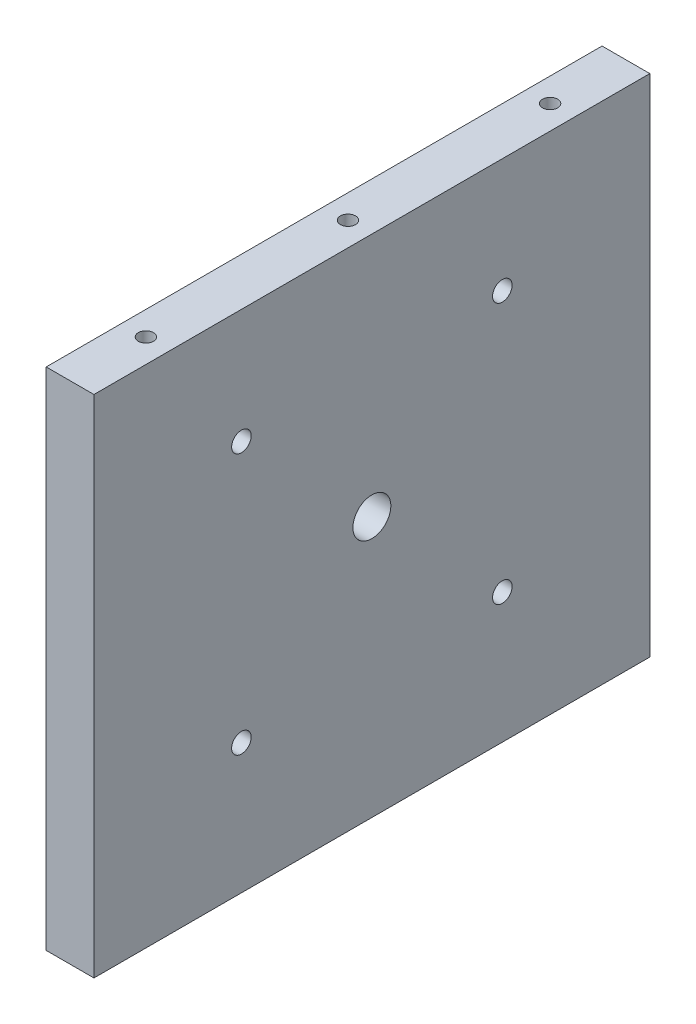
ISO-10303-21;
HEADER;
FILE_DESCRIPTION(('STEP AP214'),'2;1');
FILE_NAME('part.step','',(''),(''),'','','');
FILE_SCHEMA(('AUTOMOTIVE_DESIGN { 1 0 10303 214 1 1 1 1 }'));
ENDSEC;
DATA;
#1=APPLICATION_CONTEXT('core data for automotive mechanical design processes');
#2=APPLICATION_PROTOCOL_DEFINITION('international standard','automotive_design',2000,#1);
#3=PRODUCT_CONTEXT('',#1,'mechanical');
#4=PRODUCT('Part','Part','',(#3));
#5=PRODUCT_RELATED_PRODUCT_CATEGORY('part','',(#4));
#6=PRODUCT_DEFINITION_FORMATION('','',#4);
#7=PRODUCT_DEFINITION_CONTEXT('part definition',#1,'design');
#8=PRODUCT_DEFINITION('design','',#6,#7);
#9=PRODUCT_DEFINITION_SHAPE('','',#8);
#10=(LENGTH_UNIT() NAMED_UNIT(*) SI_UNIT(.MILLI.,.METRE.));
#11=(NAMED_UNIT(*) PLANE_ANGLE_UNIT() SI_UNIT($,.RADIAN.));
#12=(NAMED_UNIT(*) SI_UNIT($,.STERADIAN.) SOLID_ANGLE_UNIT());
#13=UNCERTAINTY_MEASURE_WITH_UNIT(LENGTH_MEASURE(1.E-05),#10,'distance_accuracy_value','');
#14=(GEOMETRIC_REPRESENTATION_CONTEXT(3) GLOBAL_UNCERTAINTY_ASSIGNED_CONTEXT((#13)) GLOBAL_UNIT_ASSIGNED_CONTEXT((#10,
#11,#12)) REPRESENTATION_CONTEXT('',''));
#15=CARTESIAN_POINT('',(0.,0.,0.));
#16=DIRECTION('',(0.,0.,1.));
#17=DIRECTION('',(1.,0.,0.));
#18=AXIS2_PLACEMENT_3D('',#15,#16,#17);
#19=CARTESIAN_POINT('',(12.,1.97,0.));
#20=DIRECTION('',(-1.,0.,0.));
#21=DIRECTION('',(0.,0.,1.));
#22=AXIS2_PLACEMENT_3D('',#19,#20,#21);
#23=CYLINDRICAL_SURFACE('',#22,4.7625);
#24=CARTESIAN_POINT('',(12.,1.97,0.));
#25=DIRECTION('',(-1.,0.,0.));
#26=DIRECTION('',(0.,0.,1.));
#27=AXIS2_PLACEMENT_3D('',#24,#25,#26);
#28=CIRCLE('',#27,4.7625);
#29=CARTESIAN_POINT('',(12.,1.97,4.7625));
#30=VERTEX_POINT('',#29);
#31=EDGE_CURVE('E170',#30,#30,#28,.T.);
#32=ORIENTED_EDGE('',*,*,#31,.F.);
#33=EDGE_LOOP('',(#32));
#34=FACE_BOUND('',#33,.T.);
#35=CARTESIAN_POINT('',(2.159,1.97,0.));
#36=DIRECTION('',(-1.,0.,0.));
#37=DIRECTION('',(0.,0.,1.));
#38=AXIS2_PLACEMENT_3D('',#35,#36,#37);
#39=CIRCLE('',#38,4.7625);
#40=CARTESIAN_POINT('',(2.159,1.97,4.7625));
#41=VERTEX_POINT('',#40);
#42=EDGE_CURVE('E47',#41,#41,#39,.F.);
#43=ORIENTED_EDGE('',*,*,#42,.F.);
#44=EDGE_LOOP('',(#43));
#45=FACE_BOUND('',#44,.T.);
#46=ADVANCED_FACE('F43',(#34,#45),#23,.F.);
#47=CARTESIAN_POINT('',(12.,-63.5,-69.85));
#48=DIRECTION('',(0.,0.,1.));
#49=DIRECTION('',(1.,0.,0.));
#50=AXIS2_PLACEMENT_3D('',#47,#48,#49);
#51=PLANE('',#50);
#52=DIRECTION('',(0.,1.,0.));
#53=VECTOR('',#52,1.);
#54=CARTESIAN_POINT('',(0.,-63.5,-69.85));
#55=LINE('',#54,#53);
#56=CARTESIAN_POINT('',(0.,-63.5,-69.85));
#57=VERTEX_POINT('',#56);
#58=CARTESIAN_POINT('',(0.,63.5,-69.85));
#59=VERTEX_POINT('',#58);
#60=EDGE_CURVE('E214',#57,#59,#55,.T.);
#61=ORIENTED_EDGE('',*,*,#60,.T.);
#62=DIRECTION('',(-1.,0.,0.));
#63=VECTOR('',#62,1.);
#64=CARTESIAN_POINT('',(12.,63.5,-69.85));
#65=LINE('',#64,#63);
#66=CARTESIAN_POINT('',(12.,63.5,-69.85));
#67=VERTEX_POINT('',#66);
#68=EDGE_CURVE('E11',#67,#59,#65,.T.);
#69=ORIENTED_EDGE('',*,*,#68,.F.);
#70=DIRECTION('',(0.,1.,0.));
#71=VECTOR('',#70,1.);
#72=CARTESIAN_POINT('',(12.,-63.5,-69.85));
#73=LINE('',#72,#71);
#74=CARTESIAN_POINT('',(12.,-63.5,-69.85));
#75=VERTEX_POINT('',#74);
#76=EDGE_CURVE('E215',#75,#67,#73,.T.);
#77=ORIENTED_EDGE('',*,*,#76,.F.);
#78=DIRECTION('',(-1.,0.,0.));
#79=VECTOR('',#78,1.);
#80=CARTESIAN_POINT('',(12.,-63.5,-69.85));
#81=LINE('',#80,#79);
#82=EDGE_CURVE('E225',#75,#57,#81,.T.);
#83=ORIENTED_EDGE('',*,*,#82,.T.);
#84=EDGE_LOOP('',(#61,#69,#77,#83));
#85=FACE_BOUND('',#84,.T.);
#86=ADVANCED_FACE('F45',(#85),#51,.F.);
#87=CARTESIAN_POINT('',(12.,63.5,69.85));
#88=DIRECTION('',(0.,-1.,0.));
#89=DIRECTION('',(0.,0.,-1.));
#90=AXIS2_PLACEMENT_3D('',#87,#88,#89);
#91=PLANE('',#90);
#92=CARTESIAN_POINT('',(6.00000000000002,63.5,-50.8));
#93=DIRECTION('',(0.,1.,0.));
#94=DIRECTION('',(0.,0.,1.));
#95=AXIS2_PLACEMENT_3D('',#92,#93,#94);
#96=CIRCLE('',#95,1.89864999999999);
#97=CARTESIAN_POINT('',(6.00000000000002,63.5,-48.90135));
#98=VERTEX_POINT('',#97);
#99=EDGE_CURVE('E124',#98,#98,#96,.T.);
#100=ORIENTED_EDGE('',*,*,#99,.F.);
#101=EDGE_LOOP('',(#100));
#102=FACE_BOUND('',#101,.T.);
#103=CARTESIAN_POINT('',(6.,63.5,0.));
#104=DIRECTION('',(0.,1.,0.));
#105=DIRECTION('',(0.,0.,1.));
#106=AXIS2_PLACEMENT_3D('',#103,#104,#105);
#107=CIRCLE('',#106,1.89864999999999);
#108=CARTESIAN_POINT('',(6.,63.5,1.89864999999999));
#109=VERTEX_POINT('',#108);
#110=EDGE_CURVE('E123',#109,#109,#107,.T.);
#111=ORIENTED_EDGE('',*,*,#110,.F.);
#112=EDGE_LOOP('',(#111));
#113=FACE_BOUND('',#112,.T.);
#114=CARTESIAN_POINT('',(6.,63.5,50.8));
#115=DIRECTION('',(0.,1.,0.));
#116=DIRECTION('',(0.,0.,1.));
#117=AXIS2_PLACEMENT_3D('',#114,#115,#116);
#118=CIRCLE('',#117,1.89864999999999);
#119=CARTESIAN_POINT('',(6.,63.5,52.69865));
#120=VERTEX_POINT('',#119);
#121=EDGE_CURVE('E138',#120,#120,#118,.T.);
#122=ORIENTED_EDGE('',*,*,#121,.F.);
#123=EDGE_LOOP('',(#122));
#124=FACE_BOUND('',#123,.T.);
#125=DIRECTION('',(0.,0.,1.));
#126=VECTOR('',#125,1.);
#127=CARTESIAN_POINT('',(0.,63.5,69.85));
#128=LINE('',#127,#126);
#129=CARTESIAN_POINT('',(0.,63.5,69.85));
#130=VERTEX_POINT('',#129);
#131=EDGE_CURVE('E229',#59,#130,#128,.T.);
#132=ORIENTED_EDGE('',*,*,#131,.T.);
#133=DIRECTION('',(-1.,0.,0.));
#134=VECTOR('',#133,1.);
#135=CARTESIAN_POINT('',(12.,63.5,69.85));
#136=LINE('',#135,#134);
#137=CARTESIAN_POINT('',(12.,63.5,69.85));
#138=VERTEX_POINT('',#137);
#139=EDGE_CURVE('E54',#138,#130,#136,.T.);
#140=ORIENTED_EDGE('',*,*,#139,.F.);
#141=DIRECTION('',(0.,0.,1.));
#142=VECTOR('',#141,1.);
#143=CARTESIAN_POINT('',(12.,63.5,69.85));
#144=LINE('',#143,#142);
#145=EDGE_CURVE('E93',#67,#138,#144,.T.);
#146=ORIENTED_EDGE('',*,*,#145,.F.);
#147=ORIENTED_EDGE('',*,*,#68,.T.);
#148=EDGE_LOOP('',(#132,#140,#146,#147));
#149=FACE_BOUND('',#148,.T.);
#150=ADVANCED_FACE('F261',(#102,#113,#124,#149),#91,.F.);
#151=CARTESIAN_POINT('',(12.,-63.5,69.85));
#152=DIRECTION('',(0.,0.,-1.));
#153=DIRECTION('',(-1.,0.,0.));
#154=AXIS2_PLACEMENT_3D('',#151,#152,#153);
#155=PLANE('',#154);
#156=DIRECTION('',(0.,-1.,0.));
#157=VECTOR('',#156,1.);
#158=CARTESIAN_POINT('',(0.,-63.5,69.85));
#159=LINE('',#158,#157);
#160=CARTESIAN_POINT('',(0.,-63.5,69.85));
#161=VERTEX_POINT('',#160);
#162=EDGE_CURVE('E80',#130,#161,#159,.T.);
#163=ORIENTED_EDGE('',*,*,#162,.T.);
#164=DIRECTION('',(-1.,0.,0.));
#165=VECTOR('',#164,1.);
#166=CARTESIAN_POINT('',(12.,-63.5,69.85));
#167=LINE('',#166,#165);
#168=CARTESIAN_POINT('',(12.,-63.5,69.85));
#169=VERTEX_POINT('',#168);
#170=EDGE_CURVE('E238',#169,#161,#167,.T.);
#171=ORIENTED_EDGE('',*,*,#170,.F.);
#172=DIRECTION('',(0.,-1.,0.));
#173=VECTOR('',#172,1.);
#174=CARTESIAN_POINT('',(12.,-63.5,69.85));
#175=LINE('',#174,#173);
#176=EDGE_CURVE('E220',#138,#169,#175,.T.);
#177=ORIENTED_EDGE('',*,*,#176,.F.);
#178=ORIENTED_EDGE('',*,*,#139,.T.);
#179=EDGE_LOOP('',(#163,#171,#177,#178));
#180=FACE_BOUND('',#179,.T.);
#181=ADVANCED_FACE('F243',(#180),#155,.F.);
#182=CARTESIAN_POINT('',(12.,-63.5,69.85));
#183=DIRECTION('',(0.,1.,0.));
#184=DIRECTION('',(0.,0.,1.));
#185=AXIS2_PLACEMENT_3D('',#182,#183,#184);
#186=PLANE('',#185);
#187=CARTESIAN_POINT('',(6.00000000000002,-63.5,-50.8));
#188=DIRECTION('',(0.,-1.,0.));
#189=DIRECTION('',(0.,0.,-1.));
#190=AXIS2_PLACEMENT_3D('',#187,#188,#189);
#191=CIRCLE('',#190,1.89864999999999);
#192=CARTESIAN_POINT('',(6.00000000000002,-63.5,-52.69865));
#193=VERTEX_POINT('',#192);
#194=EDGE_CURVE('E146',#193,#193,#191,.T.);
#195=ORIENTED_EDGE('',*,*,#194,.F.);
#196=EDGE_LOOP('',(#195));
#197=FACE_BOUND('',#196,.T.);
#198=CARTESIAN_POINT('',(6.,-63.5,0.));
#199=DIRECTION('',(0.,-1.,0.));
#200=DIRECTION('',(0.,0.,-1.));
#201=AXIS2_PLACEMENT_3D('',#198,#199,#200);
#202=CIRCLE('',#201,1.89864999999999);
#203=CARTESIAN_POINT('',(6.,-63.5,-1.89864999999999));
#204=VERTEX_POINT('',#203);
#205=EDGE_CURVE('E154',#204,#204,#202,.T.);
#206=ORIENTED_EDGE('',*,*,#205,.F.);
#207=EDGE_LOOP('',(#206));
#208=FACE_BOUND('',#207,.T.);
#209=CARTESIAN_POINT('',(6.,-63.5,50.8));
#210=DIRECTION('',(0.,-1.,0.));
#211=DIRECTION('',(0.,0.,-1.));
#212=AXIS2_PLACEMENT_3D('',#209,#210,#211);
#213=CIRCLE('',#212,1.89864999999999);
#214=CARTESIAN_POINT('',(6.,-63.5,48.90135));
#215=VERTEX_POINT('',#214);
#216=EDGE_CURVE('E162',#215,#215,#213,.T.);
#217=ORIENTED_EDGE('',*,*,#216,.F.);
#218=EDGE_LOOP('',(#217));
#219=FACE_BOUND('',#218,.T.);
#220=DIRECTION('',(0.,0.,-1.));
#221=VECTOR('',#220,1.);
#222=CARTESIAN_POINT('',(0.,-63.5,69.85));
#223=LINE('',#222,#221);
#224=EDGE_CURVE('E86',#161,#57,#223,.T.);
#225=ORIENTED_EDGE('',*,*,#224,.T.);
#226=ORIENTED_EDGE('',*,*,#82,.F.);
#227=DIRECTION('',(0.,0.,-1.));
#228=VECTOR('',#227,1.);
#229=CARTESIAN_POINT('',(12.,-63.5,69.85));
#230=LINE('',#229,#228);
#231=EDGE_CURVE('E62',#169,#75,#230,.T.);
#232=ORIENTED_EDGE('',*,*,#231,.F.);
#233=ORIENTED_EDGE('',*,*,#170,.T.);
#234=EDGE_LOOP('',(#225,#226,#232,#233));
#235=FACE_BOUND('',#234,.T.);
#236=ADVANCED_FACE('F250',(#197,#208,#219,#235),#186,.F.);
#237=CARTESIAN_POINT('',(12.,0.,0.));
#238=DIRECTION('',(-1.,0.,0.));
#239=DIRECTION('',(0.,0.,1.));
#240=AXIS2_PLACEMENT_3D('',#237,#238,#239);
#241=PLANE('',#240);
#242=ORIENTED_EDGE('',*,*,#31,.T.);
#243=EDGE_LOOP('',(#242));
#244=FACE_BOUND('',#243,.T.);
#245=CARTESIAN_POINT('',(12.,34.7569150980235,-32.7869150980234));
#246=DIRECTION('',(-1.,0.,0.));
#247=DIRECTION('',(0.,0.,1.));
#248=AXIS2_PLACEMENT_3D('',#245,#246,#247);
#249=CIRCLE('',#248,2.45745);
#250=CARTESIAN_POINT('',(12.,34.7569150980235,-30.3294650980234));
#251=VERTEX_POINT('',#250);
#252=EDGE_CURVE('E186',#251,#251,#249,.T.);
#253=ORIENTED_EDGE('',*,*,#252,.T.);
#254=EDGE_LOOP('',(#253));
#255=FACE_BOUND('',#254,.T.);
#256=CARTESIAN_POINT('',(12.,34.7569150980235,32.7869150980234));
#257=DIRECTION('',(-1.,0.,0.));
#258=DIRECTION('',(0.,0.,1.));
#259=AXIS2_PLACEMENT_3D('',#256,#257,#258);
#260=CIRCLE('',#259,2.45745);
#261=CARTESIAN_POINT('',(12.,34.7569150980235,35.2443650980234));
#262=VERTEX_POINT('',#261);
#263=EDGE_CURVE('E194',#262,#262,#260,.T.);
#264=ORIENTED_EDGE('',*,*,#263,.T.);
#265=EDGE_LOOP('',(#264));
#266=FACE_BOUND('',#265,.T.);
#267=CARTESIAN_POINT('',(12.,-30.8169150980235,32.7869150980234));
#268=DIRECTION('',(-1.,0.,0.));
#269=DIRECTION('',(0.,0.,1.));
#270=AXIS2_PLACEMENT_3D('',#267,#268,#269);
#271=CIRCLE('',#270,2.45745);
#272=CARTESIAN_POINT('',(12.,-30.8169150980235,35.2443650980234));
#273=VERTEX_POINT('',#272);
#274=EDGE_CURVE('E202',#273,#273,#271,.T.);
#275=ORIENTED_EDGE('',*,*,#274,.T.);
#276=EDGE_LOOP('',(#275));
#277=FACE_BOUND('',#276,.T.);
#278=CARTESIAN_POINT('',(12.,-30.8169150980235,-32.7869150980234));
#279=DIRECTION('',(-1.,0.,0.));
#280=DIRECTION('',(0.,0.,1.));
#281=AXIS2_PLACEMENT_3D('',#278,#279,#280);
#282=CIRCLE('',#281,2.45745);
#283=CARTESIAN_POINT('',(12.,-30.8169150980235,-30.3294650980234));
#284=VERTEX_POINT('',#283);
#285=EDGE_CURVE('E210',#284,#284,#282,.T.);
#286=ORIENTED_EDGE('',*,*,#285,.T.);
#287=EDGE_LOOP('',(#286));
#288=FACE_BOUND('',#287,.T.);
#289=ORIENTED_EDGE('',*,*,#76,.T.);
#290=ORIENTED_EDGE('',*,*,#145,.T.);
#291=ORIENTED_EDGE('',*,*,#176,.T.);
#292=ORIENTED_EDGE('',*,*,#231,.T.);
#293=EDGE_LOOP('',(#289,#290,#291,#292));
#294=FACE_BOUND('',#293,.T.);
#295=ADVANCED_FACE('F252',(#244,#255,#266,#277,#288,#294),#241,.F.);
#296=CARTESIAN_POINT('',(0.,0.,0.));
#297=DIRECTION('',(-1.,0.,0.));
#298=DIRECTION('',(0.,0.,1.));
#299=AXIS2_PLACEMENT_3D('',#296,#297,#298);
#300=PLANE('',#299);
#301=CARTESIAN_POINT('',(0.,1.97,0.));
#302=DIRECTION('',(-1.,0.,0.));
#303=DIRECTION('',(0.,0.,1.));
#304=AXIS2_PLACEMENT_3D('',#301,#302,#303);
#305=CIRCLE('',#304,43.18);
#306=CARTESIAN_POINT('',(0.,1.97,43.18));
#307=VERTEX_POINT('',#306);
#308=EDGE_CURVE('E174',#307,#307,#305,.T.);
#309=ORIENTED_EDGE('',*,*,#308,.F.);
#310=EDGE_LOOP('',(#309));
#311=FACE_BOUND('',#310,.T.);
#312=CARTESIAN_POINT('',(0.,34.7569150980235,-32.7869150980234));
#313=DIRECTION('',(-1.,0.,0.));
#314=DIRECTION('',(0.,0.,1.));
#315=AXIS2_PLACEMENT_3D('',#312,#313,#314);
#316=CIRCLE('',#315,2.45745);
#317=CARTESIAN_POINT('',(0.,34.7569150980235,-30.3294650980234));
#318=VERTEX_POINT('',#317);
#319=EDGE_CURVE('E179',#318,#318,#316,.T.);
#320=ORIENTED_EDGE('',*,*,#319,.F.);
#321=EDGE_LOOP('',(#320));
#322=FACE_BOUND('',#321,.T.);
#323=CARTESIAN_POINT('',(0.,34.7569150980235,32.7869150980234));
#324=DIRECTION('',(-1.,0.,0.));
#325=DIRECTION('',(0.,0.,1.));
#326=AXIS2_PLACEMENT_3D('',#323,#324,#325);
#327=CIRCLE('',#326,2.45745);
#328=CARTESIAN_POINT('',(0.,34.7569150980235,35.2443650980234));
#329=VERTEX_POINT('',#328);
#330=EDGE_CURVE('E190',#329,#329,#327,.T.);
#331=ORIENTED_EDGE('',*,*,#330,.F.);
#332=EDGE_LOOP('',(#331));
#333=FACE_BOUND('',#332,.T.);
#334=CARTESIAN_POINT('',(0.,-30.8169150980235,32.7869150980234));
#335=DIRECTION('',(-1.,0.,0.));
#336=DIRECTION('',(0.,0.,1.));
#337=AXIS2_PLACEMENT_3D('',#334,#335,#336);
#338=CIRCLE('',#337,2.45745);
#339=CARTESIAN_POINT('',(0.,-30.8169150980235,35.2443650980234));
#340=VERTEX_POINT('',#339);
#341=EDGE_CURVE('E198',#340,#340,#338,.T.);
#342=ORIENTED_EDGE('',*,*,#341,.F.);
#343=EDGE_LOOP('',(#342));
#344=FACE_BOUND('',#343,.T.);
#345=CARTESIAN_POINT('',(0.,-30.8169150980235,-32.7869150980234));
#346=DIRECTION('',(-1.,0.,0.));
#347=DIRECTION('',(0.,0.,1.));
#348=AXIS2_PLACEMENT_3D('',#345,#346,#347);
#349=CIRCLE('',#348,2.45745);
#350=CARTESIAN_POINT('',(0.,-30.8169150980235,-30.3294650980234));
#351=VERTEX_POINT('',#350);
#352=EDGE_CURVE('E206',#351,#351,#349,.T.);
#353=ORIENTED_EDGE('',*,*,#352,.F.);
#354=EDGE_LOOP('',(#353));
#355=FACE_BOUND('',#354,.T.);
#356=ORIENTED_EDGE('',*,*,#60,.F.);
#357=ORIENTED_EDGE('',*,*,#224,.F.);
#358=ORIENTED_EDGE('',*,*,#162,.F.);
#359=ORIENTED_EDGE('',*,*,#131,.F.);
#360=EDGE_LOOP('',(#356,#357,#358,#359));
#361=FACE_BOUND('',#360,.T.);
#362=ADVANCED_FACE('F246',(#311,#322,#333,#344,#355,#361),#300,.T.);
#363=CARTESIAN_POINT('',(0.,-30.8169150980235,-32.7869150980234));
#364=DIRECTION('',(-1.,0.,0.));
#365=DIRECTION('',(0.,0.,1.));
#366=AXIS2_PLACEMENT_3D('',#363,#364,#365);
#367=CYLINDRICAL_SURFACE('',#366,2.45745);
#368=ORIENTED_EDGE('',*,*,#285,.F.);
#369=EDGE_LOOP('',(#368));
#370=FACE_BOUND('',#369,.T.);
#371=ORIENTED_EDGE('',*,*,#352,.T.);
#372=EDGE_LOOP('',(#371));
#373=FACE_BOUND('',#372,.T.);
#374=ADVANCED_FACE('F297',(#370,#373),#367,.F.);
#375=CARTESIAN_POINT('',(0.,-30.8169150980235,32.7869150980234));
#376=DIRECTION('',(-1.,0.,0.));
#377=DIRECTION('',(0.,0.,1.));
#378=AXIS2_PLACEMENT_3D('',#375,#376,#377);
#379=CYLINDRICAL_SURFACE('',#378,2.45745);
#380=ORIENTED_EDGE('',*,*,#274,.F.);
#381=EDGE_LOOP('',(#380));
#382=FACE_BOUND('',#381,.T.);
#383=ORIENTED_EDGE('',*,*,#341,.T.);
#384=EDGE_LOOP('',(#383));
#385=FACE_BOUND('',#384,.T.);
#386=ADVANCED_FACE('F293',(#382,#385),#379,.F.);
#387=CARTESIAN_POINT('',(0.,34.7569150980235,32.7869150980234));
#388=DIRECTION('',(-1.,0.,0.));
#389=DIRECTION('',(0.,0.,1.));
#390=AXIS2_PLACEMENT_3D('',#387,#388,#389);
#391=CYLINDRICAL_SURFACE('',#390,2.45745);
#392=ORIENTED_EDGE('',*,*,#263,.F.);
#393=EDGE_LOOP('',(#392));
#394=FACE_BOUND('',#393,.T.);
#395=ORIENTED_EDGE('',*,*,#330,.T.);
#396=EDGE_LOOP('',(#395));
#397=FACE_BOUND('',#396,.T.);
#398=ADVANCED_FACE('F289',(#394,#397),#391,.F.);
#399=CARTESIAN_POINT('',(0.,34.7569150980235,-32.7869150980234));
#400=DIRECTION('',(-1.,0.,0.));
#401=DIRECTION('',(0.,0.,1.));
#402=AXIS2_PLACEMENT_3D('',#399,#400,#401);
#403=CYLINDRICAL_SURFACE('',#402,2.45745);
#404=ORIENTED_EDGE('',*,*,#252,.F.);
#405=EDGE_LOOP('',(#404));
#406=FACE_BOUND('',#405,.T.);
#407=ORIENTED_EDGE('',*,*,#319,.T.);
#408=EDGE_LOOP('',(#407));
#409=FACE_BOUND('',#408,.T.);
#410=ADVANCED_FACE('F285',(#406,#409),#403,.F.);
#411=CARTESIAN_POINT('',(1.27,1.97,0.));
#412=DIRECTION('',(-1.,0.,0.));
#413=DIRECTION('',(0.,0.,1.));
#414=AXIS2_PLACEMENT_3D('',#411,#412,#413);
#415=CYLINDRICAL_SURFACE('',#414,43.18);
#416=CARTESIAN_POINT('',(1.27,1.97,0.));
#417=DIRECTION('',(-1.,0.,0.));
#418=DIRECTION('',(0.,0.,1.));
#419=AXIS2_PLACEMENT_3D('',#416,#417,#418);
#420=CIRCLE('',#419,43.18);
#421=CARTESIAN_POINT('',(1.27,1.97,43.18));
#422=VERTEX_POINT('',#421);
#423=EDGE_CURVE('E175',#422,#422,#420,.T.);
#424=ORIENTED_EDGE('',*,*,#423,.F.);
#425=EDGE_LOOP('',(#424));
#426=FACE_BOUND('',#425,.T.);
#427=ORIENTED_EDGE('',*,*,#308,.T.);
#428=EDGE_LOOP('',(#427));
#429=FACE_BOUND('',#428,.T.);
#430=ADVANCED_FACE('F281',(#426,#429),#415,.F.);
#431=CARTESIAN_POINT('',(1.27,0.,0.));
#432=DIRECTION('',(-1.,0.,0.));
#433=DIRECTION('',(0.,0.,1.));
#434=AXIS2_PLACEMENT_3D('',#431,#432,#433);
#435=PLANE('',#434);
#436=CARTESIAN_POINT('',(1.27,1.97,0.));
#437=DIRECTION('',(-1.,0.,0.));
#438=DIRECTION('',(0.,0.,1.));
#439=AXIS2_PLACEMENT_3D('',#436,#437,#438);
#440=CIRCLE('',#439,5.715);
#441=CARTESIAN_POINT('',(1.27,1.97,5.715));
#442=VERTEX_POINT('',#441);
#443=EDGE_CURVE('E603',#442,#442,#440,.T.);
#444=ORIENTED_EDGE('',*,*,#443,.F.);
#445=EDGE_LOOP('',(#444));
#446=FACE_BOUND('',#445,.T.);
#447=ORIENTED_EDGE('',*,*,#423,.T.);
#448=EDGE_LOOP('',(#447));
#449=FACE_BOUND('',#448,.T.);
#450=ADVANCED_FACE('F278',(#446,#449),#435,.T.);
#451=CARTESIAN_POINT('',(6.,-50.8,50.8));
#452=DIRECTION('',(0.,-1.,0.));
#453=DIRECTION('',(0.,0.,-1.));
#454=AXIS2_PLACEMENT_3D('',#451,#452,#453);
#455=CONICAL_SURFACE('',#454,1.89865,1.02974425867666);
#456=CARTESIAN_POINT('',(6.,-49.6591759856833,50.8));
#457=VERTEX_POINT('',#456);
#458=VERTEX_LOOP('',#457);
#459=FACE_BOUND('',#458,.T.);
#460=CARTESIAN_POINT('',(6.,-50.8,50.8));
#461=DIRECTION('',(0.,-1.,0.));
#462=DIRECTION('',(0.,0.,-1.));
#463=AXIS2_PLACEMENT_3D('',#460,#461,#462);
#464=CIRCLE('',#463,1.89865);
#465=CARTESIAN_POINT('',(6.,-50.8,48.90135));
#466=VERTEX_POINT('',#465);
#467=EDGE_CURVE('E166',#466,#466,#464,.T.);
#468=ORIENTED_EDGE('',*,*,#467,.T.);
#469=EDGE_LOOP('',(#468));
#470=FACE_BOUND('',#469,.T.);
#471=ADVANCED_FACE('F276',(#459,#470),#455,.F.);
#472=CARTESIAN_POINT('',(6.,-63.5,50.8));
#473=DIRECTION('',(0.,-1.,0.));
#474=DIRECTION('',(0.,0.,-1.));
#475=AXIS2_PLACEMENT_3D('',#472,#473,#474);
#476=CYLINDRICAL_SURFACE('',#475,1.89864999999999);
#477=ORIENTED_EDGE('',*,*,#467,.F.);
#478=EDGE_LOOP('',(#477));
#479=FACE_BOUND('',#478,.T.);
#480=ORIENTED_EDGE('',*,*,#216,.T.);
#481=EDGE_LOOP('',(#480));
#482=FACE_BOUND('',#481,.T.);
#483=ADVANCED_FACE('F353',(#479,#482),#476,.F.);
#484=CARTESIAN_POINT('',(6.,-50.8,0.));
#485=DIRECTION('',(0.,-1.,0.));
#486=DIRECTION('',(0.,0.,-1.));
#487=AXIS2_PLACEMENT_3D('',#484,#485,#486);
#488=CONICAL_SURFACE('',#487,1.89865,1.02974425867666);
#489=CARTESIAN_POINT('',(6.,-49.6591759856833,0.));
#490=VERTEX_POINT('',#489);
#491=VERTEX_LOOP('',#490);
#492=FACE_BOUND('',#491,.T.);
#493=CARTESIAN_POINT('',(6.,-50.8,0.));
#494=DIRECTION('',(0.,-1.,0.));
#495=DIRECTION('',(0.,0.,-1.));
#496=AXIS2_PLACEMENT_3D('',#493,#494,#495);
#497=CIRCLE('',#496,1.89865);
#498=CARTESIAN_POINT('',(6.,-50.8,-1.89865));
#499=VERTEX_POINT('',#498);
#500=EDGE_CURVE('E158',#499,#499,#497,.T.);
#501=ORIENTED_EDGE('',*,*,#500,.T.);
#502=EDGE_LOOP('',(#501));
#503=FACE_BOUND('',#502,.T.);
#504=ADVANCED_FACE('F360',(#492,#503),#488,.F.);
#505=CARTESIAN_POINT('',(6.,-63.5,0.));
#506=DIRECTION('',(0.,-1.,0.));
#507=DIRECTION('',(0.,0.,-1.));
#508=AXIS2_PLACEMENT_3D('',#505,#506,#507);
#509=CYLINDRICAL_SURFACE('',#508,1.89864999999999);
#510=ORIENTED_EDGE('',*,*,#500,.F.);
#511=EDGE_LOOP('',(#510));
#512=FACE_BOUND('',#511,.T.);
#513=ORIENTED_EDGE('',*,*,#205,.T.);
#514=EDGE_LOOP('',(#513));
#515=FACE_BOUND('',#514,.T.);
#516=ADVANCED_FACE('F367',(#512,#515),#509,.F.);
#517=CARTESIAN_POINT('',(6.00000000000002,-50.8,-50.8));
#518=DIRECTION('',(0.,-1.,0.));
#519=DIRECTION('',(0.,0.,-1.));
#520=AXIS2_PLACEMENT_3D('',#517,#518,#519);
#521=CONICAL_SURFACE('',#520,1.89865,1.02974425867666);
#522=CARTESIAN_POINT('',(6.00000000000001,-49.6591759856833,-50.8));
#523=VERTEX_POINT('',#522);
#524=VERTEX_LOOP('',#523);
#525=FACE_BOUND('',#524,.T.);
#526=CARTESIAN_POINT('',(6.00000000000002,-50.8,-50.8));
#527=DIRECTION('',(0.,-1.,0.));
#528=DIRECTION('',(0.,0.,-1.));
#529=AXIS2_PLACEMENT_3D('',#526,#527,#528);
#530=CIRCLE('',#529,1.89865);
#531=CARTESIAN_POINT('',(6.00000000000002,-50.8,-52.69865));
#532=VERTEX_POINT('',#531);
#533=EDGE_CURVE('E150',#532,#532,#530,.T.);
#534=ORIENTED_EDGE('',*,*,#533,.T.);
#535=EDGE_LOOP('',(#534));
#536=FACE_BOUND('',#535,.T.);
#537=ADVANCED_FACE('F375',(#525,#536),#521,.F.);
#538=CARTESIAN_POINT('',(6.00000000000002,-63.5,-50.8));
#539=DIRECTION('',(0.,-1.,0.));
#540=DIRECTION('',(0.,0.,-1.));
#541=AXIS2_PLACEMENT_3D('',#538,#539,#540);
#542=CYLINDRICAL_SURFACE('',#541,1.89864999999999);
#543=ORIENTED_EDGE('',*,*,#533,.F.);
#544=EDGE_LOOP('',(#543));
#545=FACE_BOUND('',#544,.T.);
#546=ORIENTED_EDGE('',*,*,#194,.T.);
#547=EDGE_LOOP('',(#546));
#548=FACE_BOUND('',#547,.T.);
#549=ADVANCED_FACE('F383',(#545,#548),#542,.F.);
#550=CARTESIAN_POINT('',(6.,50.8,50.8));
#551=DIRECTION('',(0.,1.,0.));
#552=DIRECTION('',(0.,0.,1.));
#553=AXIS2_PLACEMENT_3D('',#550,#551,#552);
#554=CONICAL_SURFACE('',#553,1.89865,1.02974425867666);
#555=CARTESIAN_POINT('',(6.,49.6591759856833,50.8));
#556=VERTEX_POINT('',#555);
#557=VERTEX_LOOP('',#556);
#558=FACE_BOUND('',#557,.T.);
#559=CARTESIAN_POINT('',(6.,50.8,50.8));
#560=DIRECTION('',(0.,1.,0.));
#561=DIRECTION('',(0.,0.,1.));
#562=AXIS2_PLACEMENT_3D('',#559,#560,#561);
#563=CIRCLE('',#562,1.89865);
#564=CARTESIAN_POINT('',(6.,50.8,52.69865));
#565=VERTEX_POINT('',#564);
#566=EDGE_CURVE('E142',#565,#565,#563,.T.);
#567=ORIENTED_EDGE('',*,*,#566,.T.);
#568=EDGE_LOOP('',(#567));
#569=FACE_BOUND('',#568,.T.);
#570=ADVANCED_FACE('F391',(#558,#569),#554,.F.);
#571=CARTESIAN_POINT('',(6.,63.5,50.8));
#572=DIRECTION('',(0.,1.,0.));
#573=DIRECTION('',(0.,0.,1.));
#574=AXIS2_PLACEMENT_3D('',#571,#572,#573);
#575=CYLINDRICAL_SURFACE('',#574,1.89864999999999);
#576=ORIENTED_EDGE('',*,*,#566,.F.);
#577=EDGE_LOOP('',(#576));
#578=FACE_BOUND('',#577,.T.);
#579=ORIENTED_EDGE('',*,*,#121,.T.);
#580=EDGE_LOOP('',(#579));
#581=FACE_BOUND('',#580,.T.);
#582=ADVANCED_FACE('F400',(#578,#581),#575,.F.);
#583=CARTESIAN_POINT('',(6.,50.8,0.));
#584=DIRECTION('',(0.,1.,0.));
#585=DIRECTION('',(0.,0.,1.));
#586=AXIS2_PLACEMENT_3D('',#583,#584,#585);
#587=CONICAL_SURFACE('',#586,1.89865,1.02974425867666);
#588=CARTESIAN_POINT('',(6.,49.6591759856833,0.));
#589=VERTEX_POINT('',#588);
#590=VERTEX_LOOP('',#589);
#591=FACE_BOUND('',#590,.T.);
#592=CARTESIAN_POINT('',(6.,50.8,0.));
#593=DIRECTION('',(0.,1.,0.));
#594=DIRECTION('',(0.,0.,1.));
#595=AXIS2_PLACEMENT_3D('',#592,#593,#594);
#596=CIRCLE('',#595,1.89865);
#597=CARTESIAN_POINT('',(6.,50.8,1.89865));
#598=VERTEX_POINT('',#597);
#599=EDGE_CURVE('E129',#598,#598,#596,.T.);
#600=ORIENTED_EDGE('',*,*,#599,.T.);
#601=EDGE_LOOP('',(#600));
#602=FACE_BOUND('',#601,.T.);
#603=ADVANCED_FACE('F408',(#591,#602),#587,.F.);
#604=CARTESIAN_POINT('',(6.,63.5,0.));
#605=DIRECTION('',(0.,1.,0.));
#606=DIRECTION('',(0.,0.,1.));
#607=AXIS2_PLACEMENT_3D('',#604,#605,#606);
#608=CYLINDRICAL_SURFACE('',#607,1.89864999999999);
#609=ORIENTED_EDGE('',*,*,#599,.F.);
#610=EDGE_LOOP('',(#609));
#611=FACE_BOUND('',#610,.T.);
#612=ORIENTED_EDGE('',*,*,#110,.T.);
#613=EDGE_LOOP('',(#612));
#614=FACE_BOUND('',#613,.T.);
#615=ADVANCED_FACE('F116',(#611,#614),#608,.F.);
#616=CARTESIAN_POINT('',(6.00000000000002,50.8,-50.8));
#617=DIRECTION('',(0.,1.,0.));
#618=DIRECTION('',(0.,0.,1.));
#619=AXIS2_PLACEMENT_3D('',#616,#617,#618);
#620=CONICAL_SURFACE('',#619,1.89865,1.02974425867666);
#621=CARTESIAN_POINT('',(6.00000000000001,49.6591759856833,-50.8));
#622=VERTEX_POINT('',#621);
#623=VERTEX_LOOP('',#622);
#624=FACE_BOUND('',#623,.T.);
#625=CARTESIAN_POINT('',(6.00000000000002,50.8,-50.8));
#626=DIRECTION('',(0.,1.,0.));
#627=DIRECTION('',(0.,0.,1.));
#628=AXIS2_PLACEMENT_3D('',#625,#626,#627);
#629=CIRCLE('',#628,1.89865);
#630=CARTESIAN_POINT('',(6.00000000000002,50.8,-48.90135));
#631=VERTEX_POINT('',#630);
#632=EDGE_CURVE('E120',#631,#631,#629,.T.);
#633=ORIENTED_EDGE('',*,*,#632,.T.);
#634=EDGE_LOOP('',(#633));
#635=FACE_BOUND('',#634,.T.);
#636=ADVANCED_FACE('F112',(#624,#635),#620,.F.);
#637=CARTESIAN_POINT('',(6.00000000000002,63.5,-50.8));
#638=DIRECTION('',(0.,1.,0.));
#639=DIRECTION('',(0.,0.,1.));
#640=AXIS2_PLACEMENT_3D('',#637,#638,#639);
#641=CYLINDRICAL_SURFACE('',#640,1.89864999999999);
#642=ORIENTED_EDGE('',*,*,#632,.F.);
#643=EDGE_LOOP('',(#642));
#644=FACE_BOUND('',#643,.T.);
#645=ORIENTED_EDGE('',*,*,#99,.T.);
#646=EDGE_LOOP('',(#645));
#647=FACE_BOUND('',#646,.T.);
#648=ADVANCED_FACE('F115',(#644,#647),#641,.F.);
#649=CARTESIAN_POINT('',(2.159,1.97,0.));
#650=DIRECTION('',(-1.,0.,0.));
#651=DIRECTION('',(0.,0.,1.));
#652=AXIS2_PLACEMENT_3D('',#649,#650,#651);
#653=PLANE('',#652);
#654=CARTESIAN_POINT('',(2.159,1.97,0.));
#655=DIRECTION('',(-1.,0.,0.));
#656=DIRECTION('',(0.,0.,1.));
#657=AXIS2_PLACEMENT_3D('',#654,#655,#656);
#658=CIRCLE('',#657,5.715);
#659=CARTESIAN_POINT('',(2.159,1.97,5.715));
#660=VERTEX_POINT('',#659);
#661=EDGE_CURVE('E600',#660,#660,#658,.T.);
#662=ORIENTED_EDGE('',*,*,#661,.T.);
#663=EDGE_LOOP('',(#662));
#664=FACE_BOUND('',#663,.T.);
#665=ORIENTED_EDGE('',*,*,#42,.T.);
#666=EDGE_LOOP('',(#665));
#667=FACE_BOUND('',#666,.T.);
#668=ADVANCED_FACE('F434',(#664,#667),#653,.T.);
#669=CARTESIAN_POINT('',(2.159,1.97,0.));
#670=DIRECTION('',(-1.,0.,0.));
#671=DIRECTION('',(0.,0.,1.));
#672=AXIS2_PLACEMENT_3D('',#669,#670,#671);
#673=CYLINDRICAL_SURFACE('',#672,5.715);
#674=ORIENTED_EDGE('',*,*,#661,.F.);
#675=EDGE_LOOP('',(#674));
#676=FACE_BOUND('',#675,.T.);
#677=ORIENTED_EDGE('',*,*,#443,.T.);
#678=EDGE_LOOP('',(#677));
#679=FACE_BOUND('',#678,.T.);
#680=ADVANCED_FACE('F440',(#676,#679),#673,.F.);
#681=CLOSED_SHELL('',(#46,#86,#150,#181,#236,#295,#362,#374,#386,#398,#410,#430,#450,#471,#483,
#504,#516,#537,#549,#570,#582,#603,#615,#636,#648,#668,#680));
#682=MANIFOLD_SOLID_BREP('B2',#681);
#683=ADVANCED_BREP_SHAPE_REPRESENTATION('',(#18,#682),#14);
#684=SHAPE_DEFINITION_REPRESENTATION(#9,#683);
ENDSEC;
END-ISO-10303-21;
